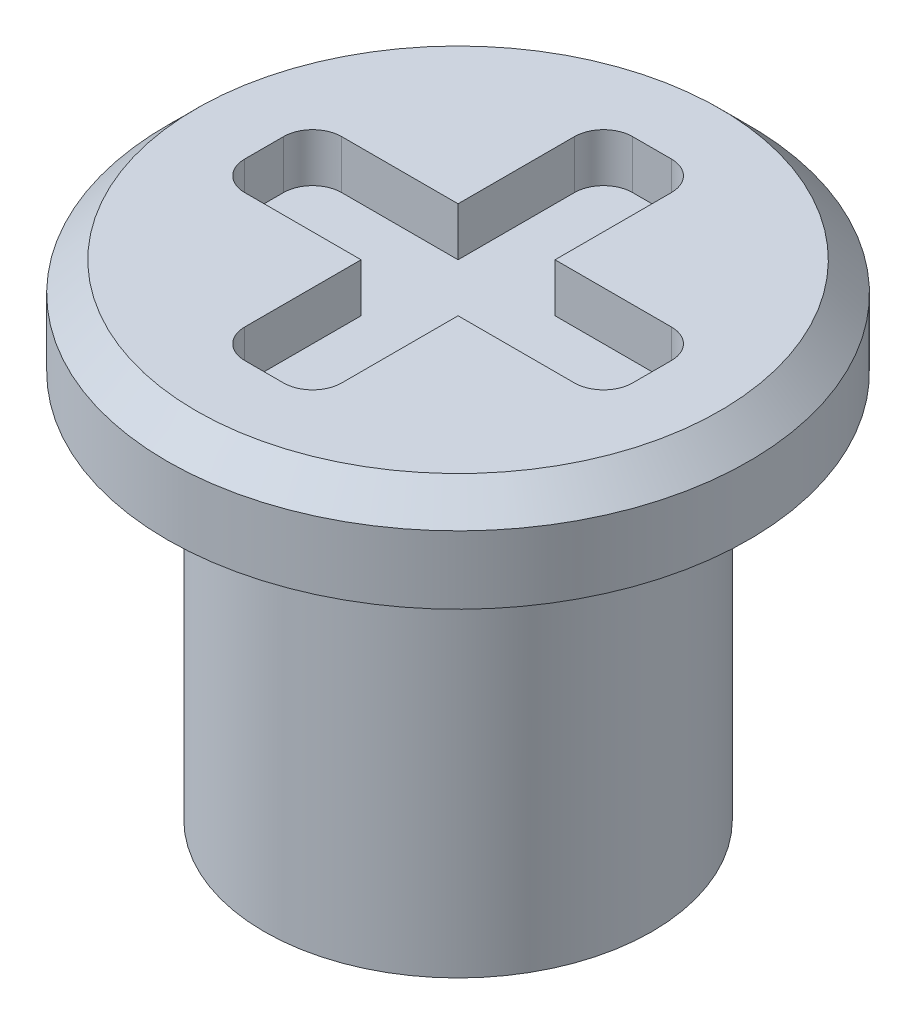
ISO-10303-21;
HEADER;
FILE_DESCRIPTION(('STEP AP214'),'2;1');
FILE_NAME('part.step','',(''),(''),'','','');
FILE_SCHEMA(('AUTOMOTIVE_DESIGN { 1 0 10303 214 1 1 1 1 }'));
ENDSEC;
DATA;
#1=APPLICATION_CONTEXT('core data for automotive mechanical design processes');
#2=APPLICATION_PROTOCOL_DEFINITION('international standard','automotive_design',2000,#1);
#3=PRODUCT_CONTEXT('',#1,'mechanical');
#4=PRODUCT('Part','Part','',(#3));
#5=PRODUCT_RELATED_PRODUCT_CATEGORY('part','',(#4));
#6=PRODUCT_DEFINITION_FORMATION('','',#4);
#7=PRODUCT_DEFINITION_CONTEXT('part definition',#1,'design');
#8=PRODUCT_DEFINITION('design','',#6,#7);
#9=PRODUCT_DEFINITION_SHAPE('','',#8);
#10=(LENGTH_UNIT() NAMED_UNIT(*) SI_UNIT(.MILLI.,.METRE.));
#11=(NAMED_UNIT(*) PLANE_ANGLE_UNIT() SI_UNIT($,.RADIAN.));
#12=(NAMED_UNIT(*) SI_UNIT($,.STERADIAN.) SOLID_ANGLE_UNIT());
#13=UNCERTAINTY_MEASURE_WITH_UNIT(LENGTH_MEASURE(1.E-05),#10,'distance_accuracy_value','');
#14=(GEOMETRIC_REPRESENTATION_CONTEXT(3) GLOBAL_UNCERTAINTY_ASSIGNED_CONTEXT((#13)) GLOBAL_UNIT_ASSIGNED_CONTEXT((#10,
#11,#12)) REPRESENTATION_CONTEXT('',''));
#15=CARTESIAN_POINT('',(0.,0.,0.));
#16=DIRECTION('',(0.,0.,1.));
#17=DIRECTION('',(1.,0.,0.));
#18=AXIS2_PLACEMENT_3D('',#15,#16,#17);
#19=CARTESIAN_POINT('',(0.,0.,0.));
#20=DIRECTION('',(0.,1.,0.));
#21=DIRECTION('',(0.,0.,1.));
#22=AXIS2_PLACEMENT_3D('',#19,#20,#21);
#23=PLANE('',#22);
#24=CARTESIAN_POINT('',(0.,0.,0.));
#25=DIRECTION('',(0.,1.,0.));
#26=DIRECTION('',(0.,0.,1.));
#27=AXIS2_PLACEMENT_3D('',#24,#25,#26);
#28=CIRCLE('',#27,1.5);
#29=CARTESIAN_POINT('',(0.,0.,1.5));
#30=VERTEX_POINT('',#29);
#31=EDGE_CURVE('E262',#30,#30,#28,.T.);
#32=ORIENTED_EDGE('',*,*,#31,.F.);
#33=EDGE_LOOP('',(#32));
#34=FACE_BOUND('',#33,.T.);
#35=CARTESIAN_POINT('',(0.,0.,0.));
#36=DIRECTION('',(0.,1.,0.));
#37=DIRECTION('',(0.,0.,1.));
#38=AXIS2_PLACEMENT_3D('',#35,#36,#37);
#39=CIRCLE('',#38,1.);
#40=CARTESIAN_POINT('',(0.,0.,1.));
#41=VERTEX_POINT('',#40);
#42=EDGE_CURVE('E11',#41,#41,#39,.F.);
#43=ORIENTED_EDGE('',*,*,#42,.F.);
#44=EDGE_LOOP('',(#43));
#45=FACE_BOUND('',#44,.T.);
#46=ADVANCED_FACE('F33',(#34,#45),#23,.F.);
#47=CARTESIAN_POINT('',(0.,0.5,0.));
#48=DIRECTION('',(0.,-1.,0.));
#49=DIRECTION('',(0.,0.,-1.));
#50=AXIS2_PLACEMENT_3D('',#47,#48,#49);
#51=CYLINDRICAL_SURFACE('',#50,1.5);
#52=CARTESIAN_POINT('',(0.,0.35,0.));
#53=DIRECTION('',(0.,1.,0.));
#54=DIRECTION('',(0.,0.,1.));
#55=AXIS2_PLACEMENT_3D('',#52,#53,#54);
#56=CIRCLE('',#55,1.5);
#57=CARTESIAN_POINT('',(0.,0.35,1.5));
#58=VERTEX_POINT('',#57);
#59=EDGE_CURVE('E41',#58,#58,#56,.F.);
#60=ORIENTED_EDGE('',*,*,#59,.T.);
#61=EDGE_LOOP('',(#60));
#62=FACE_BOUND('',#61,.T.);
#63=ORIENTED_EDGE('',*,*,#31,.T.);
#64=EDGE_LOOP('',(#63));
#65=FACE_BOUND('',#64,.T.);
#66=ADVANCED_FACE('F303',(#62,#65),#51,.T.);
#67=CARTESIAN_POINT('',(0.,0.5,0.));
#68=DIRECTION('',(0.,1.,0.));
#69=DIRECTION('',(0.,0.,1.));
#70=AXIS2_PLACEMENT_3D('',#67,#68,#69);
#71=PLANE('',#70);
#72=CARTESIAN_POINT('',(0.,0.5,0.));
#73=DIRECTION('',(0.,1.,0.));
#74=DIRECTION('',(0.,0.,1.));
#75=AXIS2_PLACEMENT_3D('',#72,#73,#74);
#76=CIRCLE('',#75,1.35);
#77=CARTESIAN_POINT('',(0.,0.5,1.35));
#78=VERTEX_POINT('',#77);
#79=EDGE_CURVE('E298',#78,#78,#76,.T.);
#80=ORIENTED_EDGE('',*,*,#79,.T.);
#81=EDGE_LOOP('',(#80));
#82=FACE_BOUND('',#81,.T.);
#83=CARTESIAN_POINT('',(0.1,0.5,0.85));
#84=DIRECTION('',(0.,1.,0.));
#85=DIRECTION('',(0.,0.,1.));
#86=AXIS2_PLACEMENT_3D('',#83,#84,#85);
#87=CIRCLE('',#86,0.15);
#88=CARTESIAN_POINT('',(0.099999999999999,0.5,1.));
#89=VERTEX_POINT('',#88);
#90=CARTESIAN_POINT('',(0.25,0.5,0.849999999999999));
#91=VERTEX_POINT('',#90);
#92=EDGE_CURVE('E48',#89,#91,#87,.T.);
#93=ORIENTED_EDGE('',*,*,#92,.F.);
#94=DIRECTION('',(1.,0.,0.));
#95=VECTOR('',#94,1.);
#96=CARTESIAN_POINT('',(-0.099999999999999,0.5,1.));
#97=LINE('',#96,#95);
#98=CARTESIAN_POINT('',(-0.099999999999999,0.5,1.));
#99=VERTEX_POINT('',#98);
#100=EDGE_CURVE('E258',#99,#89,#97,.T.);
#101=ORIENTED_EDGE('',*,*,#100,.F.);
#102=CARTESIAN_POINT('',(-0.1,0.5,0.85));
#103=DIRECTION('',(0.,1.,0.));
#104=DIRECTION('',(0.,0.,-1.));
#105=AXIS2_PLACEMENT_3D('',#102,#103,#104);
#106=CIRCLE('',#105,0.15);
#107=CARTESIAN_POINT('',(-0.25,0.5,0.849999999999999));
#108=VERTEX_POINT('',#107);
#109=EDGE_CURVE('E256',#108,#99,#106,.T.);
#110=ORIENTED_EDGE('',*,*,#109,.F.);
#111=DIRECTION('',(0.,0.,1.));
#112=VECTOR('',#111,1.);
#113=CARTESIAN_POINT('',(-0.25,0.5,0.849999999999999));
#114=LINE('',#113,#112);
#115=CARTESIAN_POINT('',(-0.25,0.5,0.25));
#116=VERTEX_POINT('',#115);
#117=EDGE_CURVE('E180',#116,#108,#114,.T.);
#118=ORIENTED_EDGE('',*,*,#117,.F.);
#119=DIRECTION('',(1.,0.,0.));
#120=VECTOR('',#119,1.);
#121=CARTESIAN_POINT('',(-0.849999999999999,0.5,0.25));
#122=LINE('',#121,#120);
#123=CARTESIAN_POINT('',(-0.849999999999999,0.5,0.25));
#124=VERTEX_POINT('',#123);
#125=EDGE_CURVE('E252',#124,#116,#122,.T.);
#126=ORIENTED_EDGE('',*,*,#125,.F.);
#127=CARTESIAN_POINT('',(-0.85,0.5,0.1));
#128=DIRECTION('',(0.,1.,0.));
#129=DIRECTION('',(0.,0.,1.));
#130=AXIS2_PLACEMENT_3D('',#127,#128,#129);
#131=CIRCLE('',#130,0.15);
#132=CARTESIAN_POINT('',(-1.,0.5,0.099999999999999));
#133=VERTEX_POINT('',#132);
#134=EDGE_CURVE('E249',#133,#124,#131,.T.);
#135=ORIENTED_EDGE('',*,*,#134,.F.);
#136=DIRECTION('',(0.,0.,1.));
#137=VECTOR('',#136,1.);
#138=CARTESIAN_POINT('',(-1.,0.5,-0.0999999999999988));
#139=LINE('',#138,#137);
#140=CARTESIAN_POINT('',(-1.,0.5,-0.0999999999999988));
#141=VERTEX_POINT('',#140);
#142=EDGE_CURVE('E246',#141,#133,#139,.T.);
#143=ORIENTED_EDGE('',*,*,#142,.F.);
#144=CARTESIAN_POINT('',(-0.85,0.5,-0.1));
#145=DIRECTION('',(0.,1.,0.));
#146=DIRECTION('',(0.,0.,1.));
#147=AXIS2_PLACEMENT_3D('',#144,#145,#146);
#148=CIRCLE('',#147,0.15);
#149=CARTESIAN_POINT('',(-0.849999999999999,0.5,-0.25));
#150=VERTEX_POINT('',#149);
#151=EDGE_CURVE('E243',#150,#141,#148,.T.);
#152=ORIENTED_EDGE('',*,*,#151,.F.);
#153=DIRECTION('',(-1.,0.,0.));
#154=VECTOR('',#153,1.);
#155=CARTESIAN_POINT('',(-0.849999999999999,0.5,-0.25));
#156=LINE('',#155,#154);
#157=CARTESIAN_POINT('',(-0.25,0.5,-0.25));
#158=VERTEX_POINT('',#157);
#159=EDGE_CURVE('E240',#158,#150,#156,.T.);
#160=ORIENTED_EDGE('',*,*,#159,.F.);
#161=DIRECTION('',(0.,0.,1.));
#162=VECTOR('',#161,1.);
#163=CARTESIAN_POINT('',(-0.25,0.5,-0.25));
#164=LINE('',#163,#162);
#165=CARTESIAN_POINT('',(-0.25,0.5,-0.849999999999999));
#166=VERTEX_POINT('',#165);
#167=EDGE_CURVE('E237',#166,#158,#164,.T.);
#168=ORIENTED_EDGE('',*,*,#167,.F.);
#169=CARTESIAN_POINT('',(-0.1,0.5,-0.85));
#170=DIRECTION('',(0.,1.,0.));
#171=DIRECTION('',(0.,0.,-1.));
#172=AXIS2_PLACEMENT_3D('',#169,#170,#171);
#173=CIRCLE('',#172,0.15);
#174=CARTESIAN_POINT('',(-0.099999999999999,0.5,-1.));
#175=VERTEX_POINT('',#174);
#176=EDGE_CURVE('E234',#175,#166,#173,.T.);
#177=ORIENTED_EDGE('',*,*,#176,.F.);
#178=DIRECTION('',(-1.,0.,0.));
#179=VECTOR('',#178,1.);
#180=CARTESIAN_POINT('',(-0.099999999999999,0.5,-1.));
#181=LINE('',#180,#179);
#182=CARTESIAN_POINT('',(0.099999999999999,0.5,-1.));
#183=VERTEX_POINT('',#182);
#184=EDGE_CURVE('E231',#183,#175,#181,.T.);
#185=ORIENTED_EDGE('',*,*,#184,.F.);
#186=CARTESIAN_POINT('',(0.1,0.5,-0.85));
#187=DIRECTION('',(0.,1.,0.));
#188=DIRECTION('',(0.,0.,-1.));
#189=AXIS2_PLACEMENT_3D('',#186,#187,#188);
#190=CIRCLE('',#189,0.15);
#191=CARTESIAN_POINT('',(0.25,0.5,-0.849999999999999));
#192=VERTEX_POINT('',#191);
#193=EDGE_CURVE('E228',#192,#183,#190,.T.);
#194=ORIENTED_EDGE('',*,*,#193,.F.);
#195=DIRECTION('',(0.,0.,-1.));
#196=VECTOR('',#195,1.);
#197=CARTESIAN_POINT('',(0.25,0.5,-0.25));
#198=LINE('',#197,#196);
#199=CARTESIAN_POINT('',(0.25,0.5,-0.25));
#200=VERTEX_POINT('',#199);
#201=EDGE_CURVE('E225',#200,#192,#198,.T.);
#202=ORIENTED_EDGE('',*,*,#201,.F.);
#203=DIRECTION('',(-1.,0.,0.));
#204=VECTOR('',#203,1.);
#205=CARTESIAN_POINT('',(0.25,0.5,-0.25));
#206=LINE('',#205,#204);
#207=CARTESIAN_POINT('',(0.849999999999999,0.5,-0.25));
#208=VERTEX_POINT('',#207);
#209=EDGE_CURVE('E222',#208,#200,#206,.T.);
#210=ORIENTED_EDGE('',*,*,#209,.F.);
#211=CARTESIAN_POINT('',(0.85,0.5,-0.0999999999999999));
#212=DIRECTION('',(0.,1.,0.));
#213=DIRECTION('',(0.,0.,-1.));
#214=AXIS2_PLACEMENT_3D('',#211,#212,#213);
#215=CIRCLE('',#214,0.15);
#216=CARTESIAN_POINT('',(1.,0.5,-0.099999999999999));
#217=VERTEX_POINT('',#216);
#218=EDGE_CURVE('E219',#217,#208,#215,.T.);
#219=ORIENTED_EDGE('',*,*,#218,.F.);
#220=DIRECTION('',(0.,0.,-1.));
#221=VECTOR('',#220,1.);
#222=CARTESIAN_POINT('',(1.,0.5,-0.099999999999999));
#223=LINE('',#222,#221);
#224=CARTESIAN_POINT('',(1.,0.5,0.099999999999999));
#225=VERTEX_POINT('',#224);
#226=EDGE_CURVE('E216',#225,#217,#223,.T.);
#227=ORIENTED_EDGE('',*,*,#226,.F.);
#228=CARTESIAN_POINT('',(0.85,0.5,0.1));
#229=DIRECTION('',(0.,1.,0.));
#230=DIRECTION('',(0.,0.,1.));
#231=AXIS2_PLACEMENT_3D('',#228,#229,#230);
#232=CIRCLE('',#231,0.15);
#233=CARTESIAN_POINT('',(0.849999999999999,0.5,0.25));
#234=VERTEX_POINT('',#233);
#235=EDGE_CURVE('E213',#234,#225,#232,.T.);
#236=ORIENTED_EDGE('',*,*,#235,.F.);
#237=DIRECTION('',(1.,0.,0.));
#238=VECTOR('',#237,1.);
#239=CARTESIAN_POINT('',(0.25,0.5,0.25));
#240=LINE('',#239,#238);
#241=CARTESIAN_POINT('',(0.25,0.5,0.25));
#242=VERTEX_POINT('',#241);
#243=EDGE_CURVE('E210',#242,#234,#240,.T.);
#244=ORIENTED_EDGE('',*,*,#243,.F.);
#245=DIRECTION('',(0.,0.,-1.));
#246=VECTOR('',#245,1.);
#247=CARTESIAN_POINT('',(0.25,0.5,0.849999999999999));
#248=LINE('',#247,#246);
#249=EDGE_CURVE('E206',#91,#242,#248,.T.);
#250=ORIENTED_EDGE('',*,*,#249,.F.);
#251=EDGE_LOOP('',(#93,#101,#110,#118,#126,#135,#143,#152,#160,#168,#177,#185,#194,#202,#210,
#219,#227,#236,#244,#250));
#252=FACE_BOUND('',#251,.T.);
#253=ADVANCED_FACE('F311',(#82,#252),#71,.T.);
#254=CARTESIAN_POINT('',(0.1,0.25,0.85));
#255=DIRECTION('',(0.,1.,0.));
#256=DIRECTION('',(0.,0.,1.));
#257=AXIS2_PLACEMENT_3D('',#254,#255,#256);
#258=CYLINDRICAL_SURFACE('',#257,0.15);
#259=ORIENTED_EDGE('',*,*,#92,.T.);
#260=DIRECTION('',(0.,1.,0.));
#261=VECTOR('',#260,1.);
#262=CARTESIAN_POINT('',(0.25,0.25,0.849999999999999));
#263=LINE('',#262,#261);
#264=CARTESIAN_POINT('',(0.25,0.25,0.849999999999999));
#265=VERTEX_POINT('',#264);
#266=EDGE_CURVE('E120',#265,#91,#263,.T.);
#267=ORIENTED_EDGE('',*,*,#266,.F.);
#268=CARTESIAN_POINT('',(0.1,0.25,0.85));
#269=DIRECTION('',(0.,1.,0.));
#270=DIRECTION('',(0.,0.,1.));
#271=AXIS2_PLACEMENT_3D('',#268,#269,#270);
#272=CIRCLE('',#271,0.15);
#273=CARTESIAN_POINT('',(0.099999999999999,0.25,1.));
#274=VERTEX_POINT('',#273);
#275=EDGE_CURVE('E260',#274,#265,#272,.T.);
#276=ORIENTED_EDGE('',*,*,#275,.F.);
#277=DIRECTION('',(0.,1.,0.));
#278=VECTOR('',#277,1.);
#279=CARTESIAN_POINT('',(0.099999999999999,0.25,1.));
#280=LINE('',#279,#278);
#281=EDGE_CURVE('E56',#274,#89,#280,.T.);
#282=ORIENTED_EDGE('',*,*,#281,.T.);
#283=EDGE_LOOP('',(#259,#267,#276,#282));
#284=FACE_BOUND('',#283,.T.);
#285=ADVANCED_FACE('F314',(#284),#258,.F.);
#286=CARTESIAN_POINT('',(-0.099999999999999,0.25,1.));
#287=DIRECTION('',(0.,0.,1.));
#288=DIRECTION('',(1.,0.,0.));
#289=AXIS2_PLACEMENT_3D('',#286,#287,#288);
#290=PLANE('',#289);
#291=ORIENTED_EDGE('',*,*,#100,.T.);
#292=ORIENTED_EDGE('',*,*,#281,.F.);
#293=DIRECTION('',(1.,0.,0.));
#294=VECTOR('',#293,1.);
#295=CARTESIAN_POINT('',(-0.099999999999999,0.25,1.));
#296=LINE('',#295,#294);
#297=CARTESIAN_POINT('',(-0.099999999999999,0.25,1.));
#298=VERTEX_POINT('',#297);
#299=EDGE_CURVE('E192',#298,#274,#296,.T.);
#300=ORIENTED_EDGE('',*,*,#299,.F.);
#301=DIRECTION('',(0.,1.,0.));
#302=VECTOR('',#301,1.);
#303=CARTESIAN_POINT('',(-0.099999999999999,0.25,1.));
#304=LINE('',#303,#302);
#305=EDGE_CURVE('E184',#298,#99,#304,.T.);
#306=ORIENTED_EDGE('',*,*,#305,.T.);
#307=EDGE_LOOP('',(#291,#292,#300,#306));
#308=FACE_BOUND('',#307,.T.);
#309=ADVANCED_FACE('F441',(#308),#290,.F.);
#310=CARTESIAN_POINT('',(-0.1,0.25,0.85));
#311=DIRECTION('',(0.,1.,0.));
#312=DIRECTION('',(0.,0.,1.));
#313=AXIS2_PLACEMENT_3D('',#310,#311,#312);
#314=CYLINDRICAL_SURFACE('',#313,0.15);
#315=ORIENTED_EDGE('',*,*,#109,.T.);
#316=ORIENTED_EDGE('',*,*,#305,.F.);
#317=CARTESIAN_POINT('',(-0.1,0.25,0.85));
#318=DIRECTION('',(0.,1.,0.));
#319=DIRECTION('',(0.,0.,-1.));
#320=AXIS2_PLACEMENT_3D('',#317,#318,#319);
#321=CIRCLE('',#320,0.15);
#322=CARTESIAN_POINT('',(-0.25,0.25,0.849999999999999));
#323=VERTEX_POINT('',#322);
#324=EDGE_CURVE('E188',#323,#298,#321,.T.);
#325=ORIENTED_EDGE('',*,*,#324,.F.);
#326=DIRECTION('',(0.,1.,0.));
#327=VECTOR('',#326,1.);
#328=CARTESIAN_POINT('',(-0.25,0.25,0.849999999999999));
#329=LINE('',#328,#327);
#330=EDGE_CURVE('E173',#323,#108,#329,.T.);
#331=ORIENTED_EDGE('',*,*,#330,.T.);
#332=EDGE_LOOP('',(#315,#316,#325,#331));
#333=FACE_BOUND('',#332,.T.);
#334=ADVANCED_FACE('F189',(#333),#314,.F.);
#335=CARTESIAN_POINT('',(-0.25,0.25,0.849999999999999));
#336=DIRECTION('',(-1.,0.,0.));
#337=DIRECTION('',(0.,0.,1.));
#338=AXIS2_PLACEMENT_3D('',#335,#336,#337);
#339=PLANE('',#338);
#340=ORIENTED_EDGE('',*,*,#117,.T.);
#341=ORIENTED_EDGE('',*,*,#330,.F.);
#342=DIRECTION('',(0.,0.,1.));
#343=VECTOR('',#342,1.);
#344=CARTESIAN_POINT('',(-0.25,0.25,0.849999999999999));
#345=LINE('',#344,#343);
#346=CARTESIAN_POINT('',(-0.25,0.25,0.25));
#347=VERTEX_POINT('',#346);
#348=EDGE_CURVE('E177',#347,#323,#345,.T.);
#349=ORIENTED_EDGE('',*,*,#348,.F.);
#350=DIRECTION('',(0.,1.,0.));
#351=VECTOR('',#350,1.);
#352=CARTESIAN_POINT('',(-0.25,0.25,0.25));
#353=LINE('',#352,#351);
#354=EDGE_CURVE('E185',#347,#116,#353,.T.);
#355=ORIENTED_EDGE('',*,*,#354,.T.);
#356=EDGE_LOOP('',(#340,#341,#349,#355));
#357=FACE_BOUND('',#356,.T.);
#358=ADVANCED_FACE('F175',(#357),#339,.F.);
#359=CARTESIAN_POINT('',(-0.849999999999999,0.25,0.25));
#360=DIRECTION('',(0.,0.,1.));
#361=DIRECTION('',(1.,0.,0.));
#362=AXIS2_PLACEMENT_3D('',#359,#360,#361);
#363=PLANE('',#362);
#364=ORIENTED_EDGE('',*,*,#125,.T.);
#365=ORIENTED_EDGE('',*,*,#354,.F.);
#366=DIRECTION('',(1.,0.,0.));
#367=VECTOR('',#366,1.);
#368=CARTESIAN_POINT('',(-0.849999999999999,0.25,0.25));
#369=LINE('',#368,#367);
#370=CARTESIAN_POINT('',(-0.849999999999999,0.25,0.25));
#371=VERTEX_POINT('',#370);
#372=EDGE_CURVE('E198',#371,#347,#369,.T.);
#373=ORIENTED_EDGE('',*,*,#372,.F.);
#374=DIRECTION('',(0.,1.,0.));
#375=VECTOR('',#374,1.);
#376=CARTESIAN_POINT('',(-0.849999999999999,0.25,0.25));
#377=LINE('',#376,#375);
#378=EDGE_CURVE('E265',#371,#124,#377,.T.);
#379=ORIENTED_EDGE('',*,*,#378,.T.);
#380=EDGE_LOOP('',(#364,#365,#373,#379));
#381=FACE_BOUND('',#380,.T.);
#382=ADVANCED_FACE('F374',(#381),#363,.F.);
#383=CARTESIAN_POINT('',(-0.85,0.25,0.1));
#384=DIRECTION('',(0.,1.,0.));
#385=DIRECTION('',(0.,0.,1.));
#386=AXIS2_PLACEMENT_3D('',#383,#384,#385);
#387=CYLINDRICAL_SURFACE('',#386,0.15);
#388=ORIENTED_EDGE('',*,*,#134,.T.);
#389=ORIENTED_EDGE('',*,*,#378,.F.);
#390=CARTESIAN_POINT('',(-0.85,0.25,0.1));
#391=DIRECTION('',(0.,1.,0.));
#392=DIRECTION('',(0.,0.,1.));
#393=AXIS2_PLACEMENT_3D('',#390,#391,#392);
#394=CIRCLE('',#393,0.15);
#395=CARTESIAN_POINT('',(-1.,0.25,0.099999999999999));
#396=VERTEX_POINT('',#395);
#397=EDGE_CURVE('E200',#396,#371,#394,.T.);
#398=ORIENTED_EDGE('',*,*,#397,.F.);
#399=DIRECTION('',(0.,1.,0.));
#400=VECTOR('',#399,1.);
#401=CARTESIAN_POINT('',(-1.,0.25,0.099999999999999));
#402=LINE('',#401,#400);
#403=EDGE_CURVE('E267',#396,#133,#402,.T.);
#404=ORIENTED_EDGE('',*,*,#403,.T.);
#405=EDGE_LOOP('',(#388,#389,#398,#404));
#406=FACE_BOUND('',#405,.T.);
#407=ADVANCED_FACE('F370',(#406),#387,.F.);
#408=CARTESIAN_POINT('',(-1.,0.25,-0.0999999999999988));
#409=DIRECTION('',(-1.,0.,0.));
#410=DIRECTION('',(0.,0.,1.));
#411=AXIS2_PLACEMENT_3D('',#408,#409,#410);
#412=PLANE('',#411);
#413=ORIENTED_EDGE('',*,*,#142,.T.);
#414=ORIENTED_EDGE('',*,*,#403,.F.);
#415=DIRECTION('',(0.,0.,1.));
#416=VECTOR('',#415,1.);
#417=CARTESIAN_POINT('',(-1.,0.25,-0.0999999999999988));
#418=LINE('',#417,#416);
#419=CARTESIAN_POINT('',(-1.,0.25,-0.0999999999999988));
#420=VERTEX_POINT('',#419);
#421=EDGE_CURVE('E365',#420,#396,#418,.T.);
#422=ORIENTED_EDGE('',*,*,#421,.F.);
#423=DIRECTION('',(0.,1.,0.));
#424=VECTOR('',#423,1.);
#425=CARTESIAN_POINT('',(-1.,0.25,-0.0999999999999988));
#426=LINE('',#425,#424);
#427=EDGE_CURVE('E269',#420,#141,#426,.T.);
#428=ORIENTED_EDGE('',*,*,#427,.T.);
#429=EDGE_LOOP('',(#413,#414,#422,#428));
#430=FACE_BOUND('',#429,.T.);
#431=ADVANCED_FACE('F379',(#430),#412,.F.);
#432=CARTESIAN_POINT('',(-0.85,0.25,-0.1));
#433=DIRECTION('',(0.,1.,0.));
#434=DIRECTION('',(0.,0.,1.));
#435=AXIS2_PLACEMENT_3D('',#432,#433,#434);
#436=CYLINDRICAL_SURFACE('',#435,0.15);
#437=ORIENTED_EDGE('',*,*,#151,.T.);
#438=ORIENTED_EDGE('',*,*,#427,.F.);
#439=CARTESIAN_POINT('',(-0.85,0.25,-0.1));
#440=DIRECTION('',(0.,1.,0.));
#441=DIRECTION('',(0.,0.,1.));
#442=AXIS2_PLACEMENT_3D('',#439,#440,#441);
#443=CIRCLE('',#442,0.15);
#444=CARTESIAN_POINT('',(-0.849999999999999,0.25,-0.25));
#445=VERTEX_POINT('',#444);
#446=EDGE_CURVE('E362',#445,#420,#443,.T.);
#447=ORIENTED_EDGE('',*,*,#446,.F.);
#448=DIRECTION('',(0.,1.,0.));
#449=VECTOR('',#448,1.);
#450=CARTESIAN_POINT('',(-0.849999999999999,0.25,-0.25));
#451=LINE('',#450,#449);
#452=EDGE_CURVE('E271',#445,#150,#451,.T.);
#453=ORIENTED_EDGE('',*,*,#452,.T.);
#454=EDGE_LOOP('',(#437,#438,#447,#453));
#455=FACE_BOUND('',#454,.T.);
#456=ADVANCED_FACE('F382',(#455),#436,.F.);
#457=CARTESIAN_POINT('',(-0.849999999999999,0.25,-0.25));
#458=DIRECTION('',(0.,0.,-1.));
#459=DIRECTION('',(-1.,0.,0.));
#460=AXIS2_PLACEMENT_3D('',#457,#458,#459);
#461=PLANE('',#460);
#462=ORIENTED_EDGE('',*,*,#159,.T.);
#463=ORIENTED_EDGE('',*,*,#452,.F.);
#464=DIRECTION('',(-1.,0.,0.));
#465=VECTOR('',#464,1.);
#466=CARTESIAN_POINT('',(-0.849999999999999,0.25,-0.25));
#467=LINE('',#466,#465);
#468=CARTESIAN_POINT('',(-0.25,0.25,-0.25));
#469=VERTEX_POINT('',#468);
#470=EDGE_CURVE('E359',#469,#445,#467,.T.);
#471=ORIENTED_EDGE('',*,*,#470,.F.);
#472=DIRECTION('',(0.,1.,0.));
#473=VECTOR('',#472,1.);
#474=CARTESIAN_POINT('',(-0.25,0.25,-0.25));
#475=LINE('',#474,#473);
#476=EDGE_CURVE('E273',#469,#158,#475,.T.);
#477=ORIENTED_EDGE('',*,*,#476,.T.);
#478=EDGE_LOOP('',(#462,#463,#471,#477));
#479=FACE_BOUND('',#478,.T.);
#480=ADVANCED_FACE('F385',(#479),#461,.F.);
#481=CARTESIAN_POINT('',(-0.25,0.25,-0.25));
#482=DIRECTION('',(-1.,0.,0.));
#483=DIRECTION('',(0.,0.,1.));
#484=AXIS2_PLACEMENT_3D('',#481,#482,#483);
#485=PLANE('',#484);
#486=ORIENTED_EDGE('',*,*,#167,.T.);
#487=ORIENTED_EDGE('',*,*,#476,.F.);
#488=DIRECTION('',(0.,0.,1.));
#489=VECTOR('',#488,1.);
#490=CARTESIAN_POINT('',(-0.25,0.25,-0.25));
#491=LINE('',#490,#489);
#492=CARTESIAN_POINT('',(-0.25,0.25,-0.849999999999999));
#493=VERTEX_POINT('',#492);
#494=EDGE_CURVE('E356',#493,#469,#491,.T.);
#495=ORIENTED_EDGE('',*,*,#494,.F.);
#496=DIRECTION('',(0.,1.,0.));
#497=VECTOR('',#496,1.);
#498=CARTESIAN_POINT('',(-0.25,0.25,-0.849999999999999));
#499=LINE('',#498,#497);
#500=EDGE_CURVE('E275',#493,#166,#499,.T.);
#501=ORIENTED_EDGE('',*,*,#500,.T.);
#502=EDGE_LOOP('',(#486,#487,#495,#501));
#503=FACE_BOUND('',#502,.T.);
#504=ADVANCED_FACE('F390',(#503),#485,.F.);
#505=CARTESIAN_POINT('',(-0.1,0.25,-0.85));
#506=DIRECTION('',(0.,1.,0.));
#507=DIRECTION('',(0.,0.,1.));
#508=AXIS2_PLACEMENT_3D('',#505,#506,#507);
#509=CYLINDRICAL_SURFACE('',#508,0.15);
#510=ORIENTED_EDGE('',*,*,#176,.T.);
#511=ORIENTED_EDGE('',*,*,#500,.F.);
#512=CARTESIAN_POINT('',(-0.1,0.25,-0.85));
#513=DIRECTION('',(0.,1.,0.));
#514=DIRECTION('',(0.,0.,-1.));
#515=AXIS2_PLACEMENT_3D('',#512,#513,#514);
#516=CIRCLE('',#515,0.15);
#517=CARTESIAN_POINT('',(-0.099999999999999,0.25,-1.));
#518=VERTEX_POINT('',#517);
#519=EDGE_CURVE('E353',#518,#493,#516,.T.);
#520=ORIENTED_EDGE('',*,*,#519,.F.);
#521=DIRECTION('',(0.,1.,0.));
#522=VECTOR('',#521,1.);
#523=CARTESIAN_POINT('',(-0.099999999999999,0.25,-1.));
#524=LINE('',#523,#522);
#525=EDGE_CURVE('E277',#518,#175,#524,.T.);
#526=ORIENTED_EDGE('',*,*,#525,.T.);
#527=EDGE_LOOP('',(#510,#511,#520,#526));
#528=FACE_BOUND('',#527,.T.);
#529=ADVANCED_FACE('F394',(#528),#509,.F.);
#530=CARTESIAN_POINT('',(-0.099999999999999,0.25,-1.));
#531=DIRECTION('',(0.,0.,-1.));
#532=DIRECTION('',(-1.,0.,0.));
#533=AXIS2_PLACEMENT_3D('',#530,#531,#532);
#534=PLANE('',#533);
#535=ORIENTED_EDGE('',*,*,#184,.T.);
#536=ORIENTED_EDGE('',*,*,#525,.F.);
#537=DIRECTION('',(-1.,0.,0.));
#538=VECTOR('',#537,1.);
#539=CARTESIAN_POINT('',(-0.099999999999999,0.25,-1.));
#540=LINE('',#539,#538);
#541=CARTESIAN_POINT('',(0.099999999999999,0.25,-1.));
#542=VERTEX_POINT('',#541);
#543=EDGE_CURVE('E350',#542,#518,#540,.T.);
#544=ORIENTED_EDGE('',*,*,#543,.F.);
#545=DIRECTION('',(0.,1.,0.));
#546=VECTOR('',#545,1.);
#547=CARTESIAN_POINT('',(0.099999999999999,0.25,-1.));
#548=LINE('',#547,#546);
#549=EDGE_CURVE('E279',#542,#183,#548,.T.);
#550=ORIENTED_EDGE('',*,*,#549,.T.);
#551=EDGE_LOOP('',(#535,#536,#544,#550));
#552=FACE_BOUND('',#551,.T.);
#553=ADVANCED_FACE('F397',(#552),#534,.F.);
#554=CARTESIAN_POINT('',(0.1,0.25,-0.85));
#555=DIRECTION('',(0.,1.,0.));
#556=DIRECTION('',(0.,0.,1.));
#557=AXIS2_PLACEMENT_3D('',#554,#555,#556);
#558=CYLINDRICAL_SURFACE('',#557,0.15);
#559=ORIENTED_EDGE('',*,*,#193,.T.);
#560=ORIENTED_EDGE('',*,*,#549,.F.);
#561=CARTESIAN_POINT('',(0.1,0.25,-0.85));
#562=DIRECTION('',(0.,1.,0.));
#563=DIRECTION('',(0.,0.,-1.));
#564=AXIS2_PLACEMENT_3D('',#561,#562,#563);
#565=CIRCLE('',#564,0.15);
#566=CARTESIAN_POINT('',(0.25,0.25,-0.849999999999999));
#567=VERTEX_POINT('',#566);
#568=EDGE_CURVE('E347',#567,#542,#565,.T.);
#569=ORIENTED_EDGE('',*,*,#568,.F.);
#570=DIRECTION('',(0.,1.,0.));
#571=VECTOR('',#570,1.);
#572=CARTESIAN_POINT('',(0.25,0.25,-0.849999999999999));
#573=LINE('',#572,#571);
#574=EDGE_CURVE('E281',#567,#192,#573,.T.);
#575=ORIENTED_EDGE('',*,*,#574,.T.);
#576=EDGE_LOOP('',(#559,#560,#569,#575));
#577=FACE_BOUND('',#576,.T.);
#578=ADVANCED_FACE('F402',(#577),#558,.F.);
#579=CARTESIAN_POINT('',(0.25,0.25,-0.25));
#580=DIRECTION('',(1.,0.,0.));
#581=DIRECTION('',(0.,0.,-1.));
#582=AXIS2_PLACEMENT_3D('',#579,#580,#581);
#583=PLANE('',#582);
#584=ORIENTED_EDGE('',*,*,#201,.T.);
#585=ORIENTED_EDGE('',*,*,#574,.F.);
#586=DIRECTION('',(0.,0.,-1.));
#587=VECTOR('',#586,1.);
#588=CARTESIAN_POINT('',(0.25,0.25,-0.25));
#589=LINE('',#588,#587);
#590=CARTESIAN_POINT('',(0.25,0.25,-0.25));
#591=VERTEX_POINT('',#590);
#592=EDGE_CURVE('E344',#591,#567,#589,.T.);
#593=ORIENTED_EDGE('',*,*,#592,.F.);
#594=DIRECTION('',(0.,1.,0.));
#595=VECTOR('',#594,1.);
#596=CARTESIAN_POINT('',(0.25,0.25,-0.25));
#597=LINE('',#596,#595);
#598=EDGE_CURVE('E283',#591,#200,#597,.T.);
#599=ORIENTED_EDGE('',*,*,#598,.T.);
#600=EDGE_LOOP('',(#584,#585,#593,#599));
#601=FACE_BOUND('',#600,.T.);
#602=ADVANCED_FACE('F406',(#601),#583,.F.);
#603=CARTESIAN_POINT('',(0.25,0.25,-0.25));
#604=DIRECTION('',(0.,0.,-1.));
#605=DIRECTION('',(-1.,0.,0.));
#606=AXIS2_PLACEMENT_3D('',#603,#604,#605);
#607=PLANE('',#606);
#608=ORIENTED_EDGE('',*,*,#209,.T.);
#609=ORIENTED_EDGE('',*,*,#598,.F.);
#610=DIRECTION('',(-1.,0.,0.));
#611=VECTOR('',#610,1.);
#612=CARTESIAN_POINT('',(0.25,0.25,-0.25));
#613=LINE('',#612,#611);
#614=CARTESIAN_POINT('',(0.849999999999999,0.25,-0.25));
#615=VERTEX_POINT('',#614);
#616=EDGE_CURVE('E341',#615,#591,#613,.T.);
#617=ORIENTED_EDGE('',*,*,#616,.F.);
#618=DIRECTION('',(0.,1.,0.));
#619=VECTOR('',#618,1.);
#620=CARTESIAN_POINT('',(0.849999999999999,0.25,-0.25));
#621=LINE('',#620,#619);
#622=EDGE_CURVE('E285',#615,#208,#621,.T.);
#623=ORIENTED_EDGE('',*,*,#622,.T.);
#624=EDGE_LOOP('',(#608,#609,#617,#623));
#625=FACE_BOUND('',#624,.T.);
#626=ADVANCED_FACE('F409',(#625),#607,.F.);
#627=CARTESIAN_POINT('',(0.85,0.25,-0.0999999999999999));
#628=DIRECTION('',(0.,1.,0.));
#629=DIRECTION('',(0.,0.,1.));
#630=AXIS2_PLACEMENT_3D('',#627,#628,#629);
#631=CYLINDRICAL_SURFACE('',#630,0.15);
#632=ORIENTED_EDGE('',*,*,#218,.T.);
#633=ORIENTED_EDGE('',*,*,#622,.F.);
#634=CARTESIAN_POINT('',(0.85,0.25,-0.0999999999999999));
#635=DIRECTION('',(0.,1.,0.));
#636=DIRECTION('',(0.,0.,-1.));
#637=AXIS2_PLACEMENT_3D('',#634,#635,#636);
#638=CIRCLE('',#637,0.15);
#639=CARTESIAN_POINT('',(1.,0.25,-0.099999999999999));
#640=VERTEX_POINT('',#639);
#641=EDGE_CURVE('E338',#640,#615,#638,.T.);
#642=ORIENTED_EDGE('',*,*,#641,.F.);
#643=DIRECTION('',(0.,1.,0.));
#644=VECTOR('',#643,1.);
#645=CARTESIAN_POINT('',(1.,0.25,-0.099999999999999));
#646=LINE('',#645,#644);
#647=EDGE_CURVE('E287',#640,#217,#646,.T.);
#648=ORIENTED_EDGE('',*,*,#647,.T.);
#649=EDGE_LOOP('',(#632,#633,#642,#648));
#650=FACE_BOUND('',#649,.T.);
#651=ADVANCED_FACE('F413',(#650),#631,.F.);
#652=CARTESIAN_POINT('',(1.,0.25,-0.099999999999999));
#653=DIRECTION('',(1.,0.,0.));
#654=DIRECTION('',(0.,0.,-1.));
#655=AXIS2_PLACEMENT_3D('',#652,#653,#654);
#656=PLANE('',#655);
#657=ORIENTED_EDGE('',*,*,#226,.T.);
#658=ORIENTED_EDGE('',*,*,#647,.F.);
#659=DIRECTION('',(0.,0.,-1.));
#660=VECTOR('',#659,1.);
#661=CARTESIAN_POINT('',(1.,0.25,-0.099999999999999));
#662=LINE('',#661,#660);
#663=CARTESIAN_POINT('',(1.,0.25,0.099999999999999));
#664=VERTEX_POINT('',#663);
#665=EDGE_CURVE('E335',#664,#640,#662,.T.);
#666=ORIENTED_EDGE('',*,*,#665,.F.);
#667=DIRECTION('',(0.,1.,0.));
#668=VECTOR('',#667,1.);
#669=CARTESIAN_POINT('',(1.,0.25,0.099999999999999));
#670=LINE('',#669,#668);
#671=EDGE_CURVE('E289',#664,#225,#670,.T.);
#672=ORIENTED_EDGE('',*,*,#671,.T.);
#673=EDGE_LOOP('',(#657,#658,#666,#672));
#674=FACE_BOUND('',#673,.T.);
#675=ADVANCED_FACE('F417',(#674),#656,.F.);
#676=CARTESIAN_POINT('',(0.85,0.25,0.1));
#677=DIRECTION('',(0.,1.,0.));
#678=DIRECTION('',(0.,0.,1.));
#679=AXIS2_PLACEMENT_3D('',#676,#677,#678);
#680=CYLINDRICAL_SURFACE('',#679,0.15);
#681=ORIENTED_EDGE('',*,*,#235,.T.);
#682=ORIENTED_EDGE('',*,*,#671,.F.);
#683=CARTESIAN_POINT('',(0.85,0.25,0.1));
#684=DIRECTION('',(0.,1.,0.));
#685=DIRECTION('',(0.,0.,1.));
#686=AXIS2_PLACEMENT_3D('',#683,#684,#685);
#687=CIRCLE('',#686,0.15);
#688=CARTESIAN_POINT('',(0.849999999999999,0.25,0.25));
#689=VERTEX_POINT('',#688);
#690=EDGE_CURVE('E332',#689,#664,#687,.T.);
#691=ORIENTED_EDGE('',*,*,#690,.F.);
#692=DIRECTION('',(0.,1.,0.));
#693=VECTOR('',#692,1.);
#694=CARTESIAN_POINT('',(0.849999999999999,0.25,0.25));
#695=LINE('',#694,#693);
#696=EDGE_CURVE('E291',#689,#234,#695,.T.);
#697=ORIENTED_EDGE('',*,*,#696,.T.);
#698=EDGE_LOOP('',(#681,#682,#691,#697));
#699=FACE_BOUND('',#698,.T.);
#700=ADVANCED_FACE('F420',(#699),#680,.F.);
#701=CARTESIAN_POINT('',(0.25,0.25,0.25));
#702=DIRECTION('',(0.,0.,1.));
#703=DIRECTION('',(1.,0.,0.));
#704=AXIS2_PLACEMENT_3D('',#701,#702,#703);
#705=PLANE('',#704);
#706=ORIENTED_EDGE('',*,*,#243,.T.);
#707=ORIENTED_EDGE('',*,*,#696,.F.);
#708=DIRECTION('',(1.,0.,0.));
#709=VECTOR('',#708,1.);
#710=CARTESIAN_POINT('',(0.25,0.25,0.25));
#711=LINE('',#710,#709);
#712=CARTESIAN_POINT('',(0.25,0.25,0.25));
#713=VERTEX_POINT('',#712);
#714=EDGE_CURVE('E326',#713,#689,#711,.T.);
#715=ORIENTED_EDGE('',*,*,#714,.F.);
#716=DIRECTION('',(0.,1.,0.));
#717=VECTOR('',#716,1.);
#718=CARTESIAN_POINT('',(0.25,0.25,0.25));
#719=LINE('',#718,#717);
#720=EDGE_CURVE('E293',#713,#242,#719,.T.);
#721=ORIENTED_EDGE('',*,*,#720,.T.);
#722=EDGE_LOOP('',(#706,#707,#715,#721));
#723=FACE_BOUND('',#722,.T.);
#724=ADVANCED_FACE('F422',(#723),#705,.F.);
#725=CARTESIAN_POINT('',(0.25,0.25,0.849999999999999));
#726=DIRECTION('',(1.,0.,0.));
#727=DIRECTION('',(0.,0.,-1.));
#728=AXIS2_PLACEMENT_3D('',#725,#726,#727);
#729=PLANE('',#728);
#730=ORIENTED_EDGE('',*,*,#249,.T.);
#731=ORIENTED_EDGE('',*,*,#720,.F.);
#732=DIRECTION('',(0.,0.,-1.));
#733=VECTOR('',#732,1.);
#734=CARTESIAN_POINT('',(0.25,0.25,0.849999999999999));
#735=LINE('',#734,#733);
#736=EDGE_CURVE('E324',#265,#713,#735,.T.);
#737=ORIENTED_EDGE('',*,*,#736,.F.);
#738=ORIENTED_EDGE('',*,*,#266,.T.);
#739=EDGE_LOOP('',(#730,#731,#737,#738));
#740=FACE_BOUND('',#739,.T.);
#741=ADVANCED_FACE('F321',(#740),#729,.F.);
#742=CARTESIAN_POINT('',(0.1,0.25,0.85));
#743=DIRECTION('',(0.,1.,0.));
#744=DIRECTION('',(0.,0.,1.));
#745=AXIS2_PLACEMENT_3D('',#742,#743,#744);
#746=PLANE('',#745);
#747=ORIENTED_EDGE('',*,*,#275,.T.);
#748=ORIENTED_EDGE('',*,*,#736,.T.);
#749=ORIENTED_EDGE('',*,*,#714,.T.);
#750=ORIENTED_EDGE('',*,*,#690,.T.);
#751=ORIENTED_EDGE('',*,*,#665,.T.);
#752=ORIENTED_EDGE('',*,*,#641,.T.);
#753=ORIENTED_EDGE('',*,*,#616,.T.);
#754=ORIENTED_EDGE('',*,*,#592,.T.);
#755=ORIENTED_EDGE('',*,*,#568,.T.);
#756=ORIENTED_EDGE('',*,*,#543,.T.);
#757=ORIENTED_EDGE('',*,*,#519,.T.);
#758=ORIENTED_EDGE('',*,*,#494,.T.);
#759=ORIENTED_EDGE('',*,*,#470,.T.);
#760=ORIENTED_EDGE('',*,*,#446,.T.);
#761=ORIENTED_EDGE('',*,*,#421,.T.);
#762=ORIENTED_EDGE('',*,*,#397,.T.);
#763=ORIENTED_EDGE('',*,*,#372,.T.);
#764=ORIENTED_EDGE('',*,*,#348,.T.);
#765=ORIENTED_EDGE('',*,*,#324,.T.);
#766=ORIENTED_EDGE('',*,*,#299,.T.);
#767=EDGE_LOOP('',(#747,#748,#749,#750,#751,#752,#753,#754,#755,#756,#757,#758,#759,#760,#761,
#762,#763,#764,#765,#766));
#768=FACE_BOUND('',#767,.T.);
#769=ADVANCED_FACE('F195',(#768),#746,.T.);
#770=CARTESIAN_POINT('',(0.,0.5,0.));
#771=DIRECTION('',(0.,-1.,0.));
#772=DIRECTION('',(0.,0.,-1.));
#773=AXIS2_PLACEMENT_3D('',#770,#771,#772);
#774=CONICAL_SURFACE('',#773,1.35,0.785398163397445);
#775=ORIENTED_EDGE('',*,*,#59,.F.);
#776=EDGE_LOOP('',(#775));
#777=FACE_BOUND('',#776,.T.);
#778=ORIENTED_EDGE('',*,*,#79,.F.);
#779=EDGE_LOOP('',(#778));
#780=FACE_BOUND('',#779,.T.);
#781=ADVANCED_FACE('F35',(#777,#780),#774,.T.);
#782=CARTESIAN_POINT('',(0.,-2.,0.));
#783=DIRECTION('',(0.,1.,0.));
#784=DIRECTION('',(0.,0.,1.));
#785=AXIS2_PLACEMENT_3D('',#782,#783,#784);
#786=CYLINDRICAL_SURFACE('',#785,1.);
#787=CARTESIAN_POINT('',(0.,-2.,0.));
#788=DIRECTION('',(0.,-1.,0.));
#789=DIRECTION('',(0.,0.,-1.));
#790=AXIS2_PLACEMENT_3D('',#787,#788,#789);
#791=CIRCLE('',#790,1.);
#792=CARTESIAN_POINT('',(0.,-2.,-1.));
#793=VERTEX_POINT('',#792);
#794=EDGE_CURVE('E207',#793,#793,#791,.T.);
#795=ORIENTED_EDGE('',*,*,#794,.F.);
#796=EDGE_LOOP('',(#795));
#797=FACE_BOUND('',#796,.T.);
#798=ORIENTED_EDGE('',*,*,#42,.T.);
#799=EDGE_LOOP('',(#798));
#800=FACE_BOUND('',#799,.T.);
#801=ADVANCED_FACE('F308',(#797,#800),#786,.T.);
#802=CARTESIAN_POINT('',(0.,-2.,0.));
#803=DIRECTION('',(0.,-1.,0.));
#804=DIRECTION('',(0.,0.,-1.));
#805=AXIS2_PLACEMENT_3D('',#802,#803,#804);
#806=PLANE('',#805);
#807=ORIENTED_EDGE('',*,*,#794,.T.);
#808=EDGE_LOOP('',(#807));
#809=FACE_BOUND('',#808,.T.);
#810=ADVANCED_FACE('F537',(#809),#806,.T.);
#811=CLOSED_SHELL('',(#46,#66,#253,#285,#309,#334,#358,#382,#407,#431,#456,#480,#504,#529,#553,
#578,#602,#626,#651,#675,#700,#724,#741,#769,#781,#801,#810));
#812=MANIFOLD_SOLID_BREP('B2',#811);
#813=ADVANCED_BREP_SHAPE_REPRESENTATION('',(#18,#812),#14);
#814=SHAPE_DEFINITION_REPRESENTATION(#9,#813);
ENDSEC;
END-ISO-10303-21;
